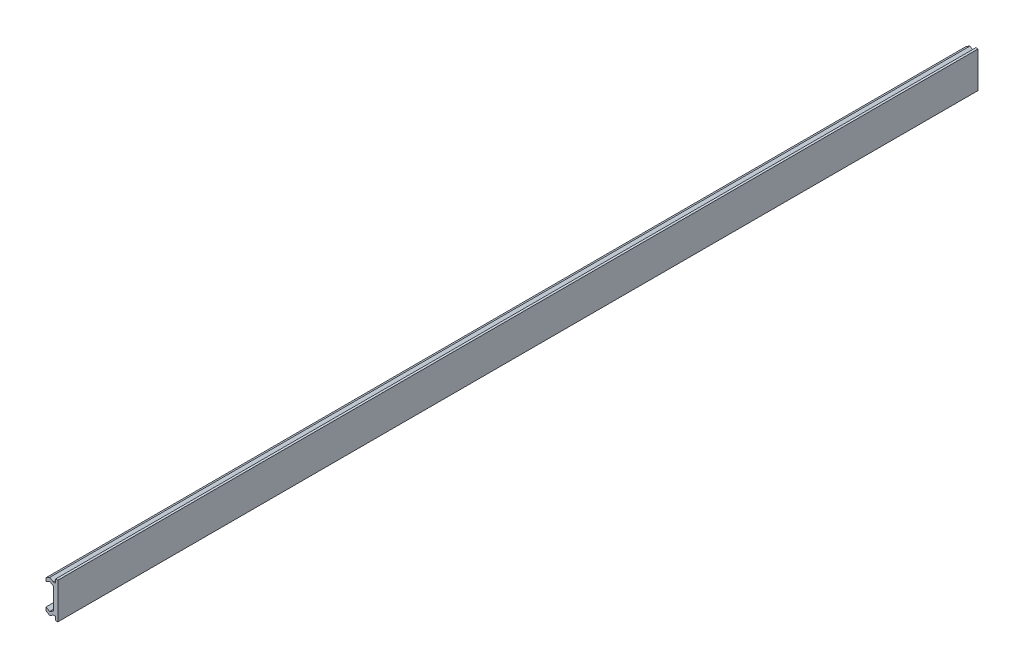
ISO-10303-21;
HEADER;
FILE_DESCRIPTION(('STEP AP214'),'2;1');
FILE_NAME('part.step','',(''),(''),'','','');
FILE_SCHEMA(('AUTOMOTIVE_DESIGN { 1 0 10303 214 1 1 1 1 }'));
ENDSEC;
DATA;
#1=APPLICATION_CONTEXT('core data for automotive mechanical design processes');
#2=APPLICATION_PROTOCOL_DEFINITION('international standard','automotive_design',2000,#1);
#3=PRODUCT_CONTEXT('',#1,'mechanical');
#4=PRODUCT('Part','Part','',(#3));
#5=PRODUCT_RELATED_PRODUCT_CATEGORY('part','',(#4));
#6=PRODUCT_DEFINITION_FORMATION('','',#4);
#7=PRODUCT_DEFINITION_CONTEXT('part definition',#1,'design');
#8=PRODUCT_DEFINITION('design','',#6,#7);
#9=PRODUCT_DEFINITION_SHAPE('','',#8);
#10=(LENGTH_UNIT() NAMED_UNIT(*) SI_UNIT(.MILLI.,.METRE.));
#11=(NAMED_UNIT(*) PLANE_ANGLE_UNIT() SI_UNIT($,.RADIAN.));
#12=(NAMED_UNIT(*) SI_UNIT($,.STERADIAN.) SOLID_ANGLE_UNIT());
#13=UNCERTAINTY_MEASURE_WITH_UNIT(LENGTH_MEASURE(1.E-05),#10,'distance_accuracy_value','');
#14=(GEOMETRIC_REPRESENTATION_CONTEXT(3) GLOBAL_UNCERTAINTY_ASSIGNED_CONTEXT((#13)) GLOBAL_UNIT_ASSIGNED_CONTEXT((#10,
#11,#12)) REPRESENTATION_CONTEXT('',''));
#15=CARTESIAN_POINT('',(0.,0.,0.));
#16=DIRECTION('',(0.,0.,1.));
#17=DIRECTION('',(1.,0.,0.));
#18=AXIS2_PLACEMENT_3D('',#15,#16,#17);
#19=CARTESIAN_POINT('',(0.,4.9,125.));
#20=DIRECTION('',(0.,-1.,0.));
#21=DIRECTION('',(0.,0.,-1.));
#22=AXIS2_PLACEMENT_3D('',#19,#20,#21);
#23=PLANE('',#22);
#24=DIRECTION('',(-1.,0.,0.));
#25=VECTOR('',#24,1.);
#26=CARTESIAN_POINT('',(0.,4.9,-125.));
#27=LINE('',#26,#25);
#28=CARTESIAN_POINT('',(0.,4.9,-125.));
#29=VERTEX_POINT('',#28);
#30=CARTESIAN_POINT('',(-0.6,4.9,-125.));
#31=VERTEX_POINT('',#30);
#32=EDGE_CURVE('E199',#29,#31,#27,.T.);
#33=ORIENTED_EDGE('',*,*,#32,.T.);
#34=DIRECTION('',(0.,0.,-1.));
#35=VECTOR('',#34,1.);
#36=CARTESIAN_POINT('',(-0.6,4.9,125.));
#37=LINE('',#36,#35);
#38=CARTESIAN_POINT('',(-0.6,4.9,125.));
#39=VERTEX_POINT('',#38);
#40=EDGE_CURVE('E11',#39,#31,#37,.T.);
#41=ORIENTED_EDGE('',*,*,#40,.F.);
#42=DIRECTION('',(-1.,0.,0.));
#43=VECTOR('',#42,1.);
#44=CARTESIAN_POINT('',(0.,4.9,125.));
#45=LINE('',#44,#43);
#46=CARTESIAN_POINT('',(0.,4.9,125.));
#47=VERTEX_POINT('',#46);
#48=EDGE_CURVE('E233',#47,#39,#45,.T.);
#49=ORIENTED_EDGE('',*,*,#48,.F.);
#50=DIRECTION('',(0.,0.,-1.));
#51=VECTOR('',#50,1.);
#52=CARTESIAN_POINT('',(0.,4.9,125.));
#53=LINE('',#52,#51);
#54=EDGE_CURVE('E195',#47,#29,#53,.T.);
#55=ORIENTED_EDGE('',*,*,#54,.T.);
#56=EDGE_LOOP('',(#33,#41,#49,#55));
#57=FACE_BOUND('',#56,.T.);
#58=ADVANCED_FACE('F41',(#57),#23,.F.);
#59=CARTESIAN_POINT('',(-0.6,4.9,125.));
#60=DIRECTION('',(1.,0.,0.));
#61=DIRECTION('',(0.,0.,-1.));
#62=AXIS2_PLACEMENT_3D('',#59,#60,#61);
#63=PLANE('',#62);
#64=DIRECTION('',(0.,-1.,0.));
#65=VECTOR('',#64,1.);
#66=CARTESIAN_POINT('',(-0.6,4.9,-125.));
#67=LINE('',#66,#65);
#68=CARTESIAN_POINT('',(-0.6,3.9,-125.));
#69=VERTEX_POINT('',#68);
#70=EDGE_CURVE('E202',#31,#69,#67,.T.);
#71=ORIENTED_EDGE('',*,*,#70,.T.);
#72=DIRECTION('',(0.,0.,-1.));
#73=VECTOR('',#72,1.);
#74=CARTESIAN_POINT('',(-0.6,3.9,125.));
#75=LINE('',#74,#73);
#76=CARTESIAN_POINT('',(-0.6,3.9,125.));
#77=VERTEX_POINT('',#76);
#78=EDGE_CURVE('E50',#77,#69,#75,.T.);
#79=ORIENTED_EDGE('',*,*,#78,.F.);
#80=DIRECTION('',(0.,-1.,0.));
#81=VECTOR('',#80,1.);
#82=CARTESIAN_POINT('',(-0.6,4.9,125.));
#83=LINE('',#82,#81);
#84=EDGE_CURVE('E131',#39,#77,#83,.T.);
#85=ORIENTED_EDGE('',*,*,#84,.F.);
#86=ORIENTED_EDGE('',*,*,#40,.T.);
#87=EDGE_LOOP('',(#71,#79,#85,#86));
#88=FACE_BOUND('',#87,.T.);
#89=ADVANCED_FACE('F356',(#88),#63,.F.);
#90=CARTESIAN_POINT('',(-0.6,3.9,125.));
#91=DIRECTION('',(0.,-1.,0.));
#92=DIRECTION('',(1.,0.,0.));
#93=AXIS2_PLACEMENT_3D('',#90,#91,#92);
#94=PLANE('',#93);
#95=DIRECTION('',(-1.,0.,0.));
#96=VECTOR('',#95,1.);
#97=CARTESIAN_POINT('',(-0.6,3.9,-125.));
#98=LINE('',#97,#96);
#99=CARTESIAN_POINT('',(-1.2,3.9,-125.));
#100=VERTEX_POINT('',#99);
#101=EDGE_CURVE('E204',#69,#100,#98,.T.);
#102=ORIENTED_EDGE('',*,*,#101,.T.);
#103=DIRECTION('',(0.,0.,-1.));
#104=VECTOR('',#103,1.);
#105=CARTESIAN_POINT('',(-1.2,3.9,125.));
#106=LINE('',#105,#104);
#107=CARTESIAN_POINT('',(-1.2,3.9,125.));
#108=VERTEX_POINT('',#107);
#109=EDGE_CURVE('E283',#108,#100,#106,.T.);
#110=ORIENTED_EDGE('',*,*,#109,.F.);
#111=DIRECTION('',(-1.,0.,0.));
#112=VECTOR('',#111,1.);
#113=CARTESIAN_POINT('',(-0.6,3.9,125.));
#114=LINE('',#113,#112);
#115=EDGE_CURVE('E293',#77,#108,#114,.T.);
#116=ORIENTED_EDGE('',*,*,#115,.F.);
#117=ORIENTED_EDGE('',*,*,#78,.T.);
#118=EDGE_LOOP('',(#102,#110,#116,#117));
#119=FACE_BOUND('',#118,.T.);
#120=ADVANCED_FACE('F291',(#119),#94,.F.);
#121=CARTESIAN_POINT('',(-1.2,3.9,125.));
#122=DIRECTION('',(-0.5,-0.866025403784439,0.));
#123=DIRECTION('',(0.866025403784438,-0.5,0.));
#124=AXIS2_PLACEMENT_3D('',#121,#122,#123);
#125=PLANE('',#124);
#126=DIRECTION('',(-0.866025403784438,0.5,0.));
#127=VECTOR('',#126,1.);
#128=CARTESIAN_POINT('',(-1.2,3.9,-125.));
#129=LINE('',#128,#127);
#130=CARTESIAN_POINT('',(-2.2,4.47735026918963,-125.));
#131=VERTEX_POINT('',#130);
#132=EDGE_CURVE('E206',#100,#131,#129,.T.);
#133=ORIENTED_EDGE('',*,*,#132,.T.);
#134=DIRECTION('',(0.,0.,-1.));
#135=VECTOR('',#134,1.);
#136=CARTESIAN_POINT('',(-2.2,4.47735026918963,125.));
#137=LINE('',#136,#135);
#138=CARTESIAN_POINT('',(-2.2,4.47735026918963,125.));
#139=VERTEX_POINT('',#138);
#140=EDGE_CURVE('E279',#139,#131,#137,.T.);
#141=ORIENTED_EDGE('',*,*,#140,.F.);
#142=DIRECTION('',(-0.866025403784438,0.5,0.));
#143=VECTOR('',#142,1.);
#144=CARTESIAN_POINT('',(-1.2,3.9,125.));
#145=LINE('',#144,#143);
#146=EDGE_CURVE('E311',#108,#139,#145,.T.);
#147=ORIENTED_EDGE('',*,*,#146,.F.);
#148=ORIENTED_EDGE('',*,*,#109,.T.);
#149=EDGE_LOOP('',(#133,#141,#147,#148));
#150=FACE_BOUND('',#149,.T.);
#151=ADVANCED_FACE('F302',(#150),#125,.F.);
#152=CARTESIAN_POINT('',(-2.2,4.47735026918963,125.));
#153=DIRECTION('',(0.500000000000002,-0.866025403784437,0.));
#154=DIRECTION('',(0.866025403784437,0.500000000000002,0.));
#155=AXIS2_PLACEMENT_3D('',#152,#153,#154);
#156=PLANE('',#155);
#157=DIRECTION('',(-0.866025403784437,-0.500000000000002,0.));
#158=VECTOR('',#157,1.);
#159=CARTESIAN_POINT('',(-2.2,4.47735026918963,-125.));
#160=LINE('',#159,#158);
#161=CARTESIAN_POINT('',(-3.2,3.9,-125.));
#162=VERTEX_POINT('',#161);
#163=EDGE_CURVE('E208',#131,#162,#160,.T.);
#164=ORIENTED_EDGE('',*,*,#163,.T.);
#165=DIRECTION('',(0.,0.,-1.));
#166=VECTOR('',#165,1.);
#167=CARTESIAN_POINT('',(-3.2,3.9,125.));
#168=LINE('',#167,#166);
#169=CARTESIAN_POINT('',(-3.2,3.9,125.));
#170=VERTEX_POINT('',#169);
#171=EDGE_CURVE('E276',#170,#162,#168,.T.);
#172=ORIENTED_EDGE('',*,*,#171,.F.);
#173=DIRECTION('',(-0.866025403784437,-0.500000000000002,0.));
#174=VECTOR('',#173,1.);
#175=CARTESIAN_POINT('',(-2.2,4.47735026918963,125.));
#176=LINE('',#175,#174);
#177=EDGE_CURVE('E308',#139,#170,#176,.T.);
#178=ORIENTED_EDGE('',*,*,#177,.F.);
#179=ORIENTED_EDGE('',*,*,#140,.T.);
#180=EDGE_LOOP('',(#164,#172,#178,#179));
#181=FACE_BOUND('',#180,.T.);
#182=ADVANCED_FACE('F306',(#181),#156,.F.);
#183=CARTESIAN_POINT('',(-3.2,3.9,125.));
#184=DIRECTION('',(1.,0.,0.));
#185=DIRECTION('',(0.,0.,-1.));
#186=AXIS2_PLACEMENT_3D('',#183,#184,#185);
#187=PLANE('',#186);
#188=DIRECTION('',(0.,-1.,0.));
#189=VECTOR('',#188,1.);
#190=CARTESIAN_POINT('',(-3.2,3.9,-125.));
#191=LINE('',#190,#189);
#192=CARTESIAN_POINT('',(-3.2,2.975,-125.));
#193=VERTEX_POINT('',#192);
#194=EDGE_CURVE('E210',#162,#193,#191,.T.);
#195=ORIENTED_EDGE('',*,*,#194,.T.);
#196=DIRECTION('',(0.,0.,-1.));
#197=VECTOR('',#196,1.);
#198=CARTESIAN_POINT('',(-3.2,2.975,125.));
#199=LINE('',#198,#197);
#200=CARTESIAN_POINT('',(-3.2,2.975,125.));
#201=VERTEX_POINT('',#200);
#202=EDGE_CURVE('E272',#201,#193,#199,.T.);
#203=ORIENTED_EDGE('',*,*,#202,.F.);
#204=DIRECTION('',(0.,-1.,0.));
#205=VECTOR('',#204,1.);
#206=CARTESIAN_POINT('',(-3.2,3.9,125.));
#207=LINE('',#206,#205);
#208=EDGE_CURVE('E310',#170,#201,#207,.T.);
#209=ORIENTED_EDGE('',*,*,#208,.F.);
#210=ORIENTED_EDGE('',*,*,#171,.T.);
#211=EDGE_LOOP('',(#195,#203,#209,#210));
#212=FACE_BOUND('',#211,.T.);
#213=ADVANCED_FACE('F369',(#212),#187,.F.);
#214=CARTESIAN_POINT('',(-3.2,2.975,125.));
#215=DIRECTION('',(-0.500000000000002,0.866025403784438,0.));
#216=DIRECTION('',(-0.866025403784438,-0.500000000000002,0.));
#217=AXIS2_PLACEMENT_3D('',#214,#215,#216);
#218=PLANE('',#217);
#219=DIRECTION('',(0.866025403784438,0.500000000000002,0.));
#220=VECTOR('',#219,1.);
#221=CARTESIAN_POINT('',(-3.2,2.975,-125.));
#222=LINE('',#221,#220);
#223=CARTESIAN_POINT('',(-2.2,3.55235026918963,-125.));
#224=VERTEX_POINT('',#223);
#225=EDGE_CURVE('E212',#193,#224,#222,.T.);
#226=ORIENTED_EDGE('',*,*,#225,.T.);
#227=DIRECTION('',(0.,0.,-1.));
#228=VECTOR('',#227,1.);
#229=CARTESIAN_POINT('',(-2.2,3.55235026918963,125.));
#230=LINE('',#229,#228);
#231=CARTESIAN_POINT('',(-2.2,3.55235026918963,125.));
#232=VERTEX_POINT('',#231);
#233=EDGE_CURVE('E268',#232,#224,#230,.T.);
#234=ORIENTED_EDGE('',*,*,#233,.F.);
#235=DIRECTION('',(0.866025403784438,0.500000000000002,0.));
#236=VECTOR('',#235,1.);
#237=CARTESIAN_POINT('',(-3.2,2.975,125.));
#238=LINE('',#237,#236);
#239=EDGE_CURVE('E313',#201,#232,#238,.T.);
#240=ORIENTED_EDGE('',*,*,#239,.F.);
#241=ORIENTED_EDGE('',*,*,#202,.T.);
#242=EDGE_LOOP('',(#226,#234,#240,#241));
#243=FACE_BOUND('',#242,.T.);
#244=ADVANCED_FACE('F372',(#243),#218,.F.);
#245=CARTESIAN_POINT('',(-2.2,3.55235026918963,125.));
#246=DIRECTION('',(0.500000000000001,0.866025403784438,0.));
#247=DIRECTION('',(-0.866025403784438,0.500000000000001,0.));
#248=AXIS2_PLACEMENT_3D('',#245,#246,#247);
#249=PLANE('',#248);
#250=DIRECTION('',(0.866025403784438,-0.500000000000001,0.));
#251=VECTOR('',#250,1.);
#252=CARTESIAN_POINT('',(-2.2,3.55235026918963,-125.));
#253=LINE('',#252,#251);
#254=CARTESIAN_POINT('',(-1.2,2.975,-125.));
#255=VERTEX_POINT('',#254);
#256=EDGE_CURVE('E214',#224,#255,#253,.T.);
#257=ORIENTED_EDGE('',*,*,#256,.T.);
#258=DIRECTION('',(0.,0.,-1.));
#259=VECTOR('',#258,1.);
#260=CARTESIAN_POINT('',(-1.2,2.975,125.));
#261=LINE('',#260,#259);
#262=CARTESIAN_POINT('',(-1.2,2.975,125.));
#263=VERTEX_POINT('',#262);
#264=EDGE_CURVE('E264',#263,#255,#261,.T.);
#265=ORIENTED_EDGE('',*,*,#264,.F.);
#266=DIRECTION('',(0.866025403784438,-0.500000000000001,0.));
#267=VECTOR('',#266,1.);
#268=CARTESIAN_POINT('',(-2.2,3.55235026918963,125.));
#269=LINE('',#268,#267);
#270=EDGE_CURVE('E319',#232,#263,#269,.T.);
#271=ORIENTED_EDGE('',*,*,#270,.F.);
#272=ORIENTED_EDGE('',*,*,#233,.T.);
#273=EDGE_LOOP('',(#257,#265,#271,#272));
#274=FACE_BOUND('',#273,.T.);
#275=ADVANCED_FACE('F376',(#274),#249,.F.);
#276=CARTESIAN_POINT('',(-1.2,2.975,125.));
#277=DIRECTION('',(1.,0.,0.));
#278=DIRECTION('',(0.,0.,-1.));
#279=AXIS2_PLACEMENT_3D('',#276,#277,#278);
#280=PLANE('',#279);
#281=DIRECTION('',(0.,-1.,0.));
#282=VECTOR('',#281,1.);
#283=CARTESIAN_POINT('',(-1.2,2.975,-125.));
#284=LINE('',#283,#282);
#285=CARTESIAN_POINT('',(-1.2,-2.975,-125.));
#286=VERTEX_POINT('',#285);
#287=EDGE_CURVE('E216',#255,#286,#284,.T.);
#288=ORIENTED_EDGE('',*,*,#287,.T.);
#289=DIRECTION('',(0.,0.,-1.));
#290=VECTOR('',#289,1.);
#291=CARTESIAN_POINT('',(-1.2,-2.975,125.));
#292=LINE('',#291,#290);
#293=CARTESIAN_POINT('',(-1.2,-2.975,125.));
#294=VERTEX_POINT('',#293);
#295=EDGE_CURVE('E260',#294,#286,#292,.T.);
#296=ORIENTED_EDGE('',*,*,#295,.F.);
#297=DIRECTION('',(0.,-1.,0.));
#298=VECTOR('',#297,1.);
#299=CARTESIAN_POINT('',(-1.2,2.975,125.));
#300=LINE('',#299,#298);
#301=EDGE_CURVE('E321',#263,#294,#300,.T.);
#302=ORIENTED_EDGE('',*,*,#301,.F.);
#303=ORIENTED_EDGE('',*,*,#264,.T.);
#304=EDGE_LOOP('',(#288,#296,#302,#303));
#305=FACE_BOUND('',#304,.T.);
#306=ADVANCED_FACE('F380',(#305),#280,.F.);
#307=CARTESIAN_POINT('',(-2.2,-3.55235026918963,125.));
#308=DIRECTION('',(0.500000000000001,-0.866025403784438,0.));
#309=DIRECTION('',(0.866025403784438,0.500000000000001,0.));
#310=AXIS2_PLACEMENT_3D('',#307,#308,#309);
#311=PLANE('',#310);
#312=DIRECTION('',(-0.866025403784438,-0.500000000000001,0.));
#313=VECTOR('',#312,1.);
#314=CARTESIAN_POINT('',(-2.2,-3.55235026918963,-125.));
#315=LINE('',#314,#313);
#316=CARTESIAN_POINT('',(-2.2,-3.55235026918963,-125.));
#317=VERTEX_POINT('',#316);
#318=EDGE_CURVE('E218',#286,#317,#315,.T.);
#319=ORIENTED_EDGE('',*,*,#318,.T.);
#320=DIRECTION('',(0.,0.,-1.));
#321=VECTOR('',#320,1.);
#322=CARTESIAN_POINT('',(-2.2,-3.55235026918963,125.));
#323=LINE('',#322,#321);
#324=CARTESIAN_POINT('',(-2.2,-3.55235026918963,125.));
#325=VERTEX_POINT('',#324);
#326=EDGE_CURVE('E256',#325,#317,#323,.T.);
#327=ORIENTED_EDGE('',*,*,#326,.F.);
#328=DIRECTION('',(-0.866025403784438,-0.500000000000001,0.));
#329=VECTOR('',#328,1.);
#330=CARTESIAN_POINT('',(-2.2,-3.55235026918963,125.));
#331=LINE('',#330,#329);
#332=EDGE_CURVE('E323',#294,#325,#331,.T.);
#333=ORIENTED_EDGE('',*,*,#332,.F.);
#334=ORIENTED_EDGE('',*,*,#295,.T.);
#335=EDGE_LOOP('',(#319,#327,#333,#334));
#336=FACE_BOUND('',#335,.T.);
#337=ADVANCED_FACE('F384',(#336),#311,.F.);
#338=CARTESIAN_POINT('',(-3.2,-2.975,125.));
#339=DIRECTION('',(-0.500000000000002,-0.866025403784438,0.));
#340=DIRECTION('',(0.866025403784438,-0.500000000000002,0.));
#341=AXIS2_PLACEMENT_3D('',#338,#339,#340);
#342=PLANE('',#341);
#343=DIRECTION('',(-0.866025403784438,0.500000000000002,0.));
#344=VECTOR('',#343,1.);
#345=CARTESIAN_POINT('',(-3.2,-2.975,-125.));
#346=LINE('',#345,#344);
#347=CARTESIAN_POINT('',(-3.2,-2.975,-125.));
#348=VERTEX_POINT('',#347);
#349=EDGE_CURVE('E220',#317,#348,#346,.T.);
#350=ORIENTED_EDGE('',*,*,#349,.T.);
#351=DIRECTION('',(0.,0.,-1.));
#352=VECTOR('',#351,1.);
#353=CARTESIAN_POINT('',(-3.2,-2.975,125.));
#354=LINE('',#353,#352);
#355=CARTESIAN_POINT('',(-3.2,-2.975,125.));
#356=VERTEX_POINT('',#355);
#357=EDGE_CURVE('E252',#356,#348,#354,.T.);
#358=ORIENTED_EDGE('',*,*,#357,.F.);
#359=DIRECTION('',(-0.866025403784438,0.500000000000002,0.));
#360=VECTOR('',#359,1.);
#361=CARTESIAN_POINT('',(-3.2,-2.975,125.));
#362=LINE('',#361,#360);
#363=EDGE_CURVE('E325',#325,#356,#362,.T.);
#364=ORIENTED_EDGE('',*,*,#363,.F.);
#365=ORIENTED_EDGE('',*,*,#326,.T.);
#366=EDGE_LOOP('',(#350,#358,#364,#365));
#367=FACE_BOUND('',#366,.T.);
#368=ADVANCED_FACE('F388',(#367),#342,.F.);
#369=CARTESIAN_POINT('',(-3.2,-3.9,125.));
#370=DIRECTION('',(1.,0.,0.));
#371=DIRECTION('',(0.,0.,-1.));
#372=AXIS2_PLACEMENT_3D('',#369,#370,#371);
#373=PLANE('',#372);
#374=DIRECTION('',(0.,-1.,0.));
#375=VECTOR('',#374,1.);
#376=CARTESIAN_POINT('',(-3.2,-3.9,-125.));
#377=LINE('',#376,#375);
#378=CARTESIAN_POINT('',(-3.2,-3.9,-125.));
#379=VERTEX_POINT('',#378);
#380=EDGE_CURVE('E222',#348,#379,#377,.T.);
#381=ORIENTED_EDGE('',*,*,#380,.T.);
#382=DIRECTION('',(0.,0.,-1.));
#383=VECTOR('',#382,1.);
#384=CARTESIAN_POINT('',(-3.2,-3.9,125.));
#385=LINE('',#384,#383);
#386=CARTESIAN_POINT('',(-3.2,-3.9,125.));
#387=VERTEX_POINT('',#386);
#388=EDGE_CURVE('E248',#387,#379,#385,.T.);
#389=ORIENTED_EDGE('',*,*,#388,.F.);
#390=DIRECTION('',(0.,-1.,0.));
#391=VECTOR('',#390,1.);
#392=CARTESIAN_POINT('',(-3.2,-3.9,125.));
#393=LINE('',#392,#391);
#394=EDGE_CURVE('E327',#356,#387,#393,.T.);
#395=ORIENTED_EDGE('',*,*,#394,.F.);
#396=ORIENTED_EDGE('',*,*,#357,.T.);
#397=EDGE_LOOP('',(#381,#389,#395,#396));
#398=FACE_BOUND('',#397,.T.);
#399=ADVANCED_FACE('F392',(#398),#373,.F.);
#400=CARTESIAN_POINT('',(-2.2,-4.47735026918963,125.));
#401=DIRECTION('',(0.500000000000002,0.866025403784437,0.));
#402=DIRECTION('',(-0.866025403784437,0.500000000000002,0.));
#403=AXIS2_PLACEMENT_3D('',#400,#401,#402);
#404=PLANE('',#403);
#405=DIRECTION('',(0.866025403784437,-0.500000000000002,0.));
#406=VECTOR('',#405,1.);
#407=CARTESIAN_POINT('',(-2.2,-4.47735026918963,-125.));
#408=LINE('',#407,#406);
#409=CARTESIAN_POINT('',(-2.2,-4.47735026918963,-125.));
#410=VERTEX_POINT('',#409);
#411=EDGE_CURVE('E224',#379,#410,#408,.T.);
#412=ORIENTED_EDGE('',*,*,#411,.T.);
#413=DIRECTION('',(0.,0.,-1.));
#414=VECTOR('',#413,1.);
#415=CARTESIAN_POINT('',(-2.2,-4.47735026918963,125.));
#416=LINE('',#415,#414);
#417=CARTESIAN_POINT('',(-2.2,-4.47735026918963,125.));
#418=VERTEX_POINT('',#417);
#419=EDGE_CURVE('E244',#418,#410,#416,.T.);
#420=ORIENTED_EDGE('',*,*,#419,.F.);
#421=DIRECTION('',(0.866025403784437,-0.500000000000002,0.));
#422=VECTOR('',#421,1.);
#423=CARTESIAN_POINT('',(-2.2,-4.47735026918963,125.));
#424=LINE('',#423,#422);
#425=EDGE_CURVE('E329',#387,#418,#424,.T.);
#426=ORIENTED_EDGE('',*,*,#425,.F.);
#427=ORIENTED_EDGE('',*,*,#388,.T.);
#428=EDGE_LOOP('',(#412,#420,#426,#427));
#429=FACE_BOUND('',#428,.T.);
#430=ADVANCED_FACE('F396',(#429),#404,.F.);
#431=CARTESIAN_POINT('',(-1.2,-3.9,125.));
#432=DIRECTION('',(-0.5,0.866025403784439,0.));
#433=DIRECTION('',(-0.866025403784438,-0.5,0.));
#434=AXIS2_PLACEMENT_3D('',#431,#432,#433);
#435=PLANE('',#434);
#436=DIRECTION('',(0.866025403784438,0.5,0.));
#437=VECTOR('',#436,1.);
#438=CARTESIAN_POINT('',(-1.2,-3.9,-125.));
#439=LINE('',#438,#437);
#440=CARTESIAN_POINT('',(-1.2,-3.9,-125.));
#441=VERTEX_POINT('',#440);
#442=EDGE_CURVE('E226',#410,#441,#439,.T.);
#443=ORIENTED_EDGE('',*,*,#442,.T.);
#444=DIRECTION('',(0.,0.,-1.));
#445=VECTOR('',#444,1.);
#446=CARTESIAN_POINT('',(-1.2,-3.9,125.));
#447=LINE('',#446,#445);
#448=CARTESIAN_POINT('',(-1.2,-3.9,125.));
#449=VERTEX_POINT('',#448);
#450=EDGE_CURVE('E240',#449,#441,#447,.T.);
#451=ORIENTED_EDGE('',*,*,#450,.F.);
#452=DIRECTION('',(0.866025403784438,0.5,0.));
#453=VECTOR('',#452,1.);
#454=CARTESIAN_POINT('',(-1.2,-3.9,125.));
#455=LINE('',#454,#453);
#456=EDGE_CURVE('E331',#418,#449,#455,.T.);
#457=ORIENTED_EDGE('',*,*,#456,.F.);
#458=ORIENTED_EDGE('',*,*,#419,.T.);
#459=EDGE_LOOP('',(#443,#451,#457,#458));
#460=FACE_BOUND('',#459,.T.);
#461=ADVANCED_FACE('F337',(#460),#435,.F.);
#462=CARTESIAN_POINT('',(-0.6,-3.9,125.));
#463=DIRECTION('',(0.,1.,0.));
#464=DIRECTION('',(-1.,0.,0.));
#465=AXIS2_PLACEMENT_3D('',#462,#463,#464);
#466=PLANE('',#465);
#467=DIRECTION('',(1.,0.,0.));
#468=VECTOR('',#467,1.);
#469=CARTESIAN_POINT('',(-0.6,-3.9,-125.));
#470=LINE('',#469,#468);
#471=CARTESIAN_POINT('',(-0.6,-3.9,-125.));
#472=VERTEX_POINT('',#471);
#473=EDGE_CURVE('E228',#441,#472,#470,.T.);
#474=ORIENTED_EDGE('',*,*,#473,.T.);
#475=DIRECTION('',(0.,0.,-1.));
#476=VECTOR('',#475,1.);
#477=CARTESIAN_POINT('',(-0.6,-3.9,125.));
#478=LINE('',#477,#476);
#479=CARTESIAN_POINT('',(-0.6,-3.9,125.));
#480=VERTEX_POINT('',#479);
#481=EDGE_CURVE('E190',#480,#472,#478,.T.);
#482=ORIENTED_EDGE('',*,*,#481,.F.);
#483=DIRECTION('',(1.,0.,0.));
#484=VECTOR('',#483,1.);
#485=CARTESIAN_POINT('',(-0.6,-3.9,125.));
#486=LINE('',#485,#484);
#487=EDGE_CURVE('E180',#449,#480,#486,.T.);
#488=ORIENTED_EDGE('',*,*,#487,.F.);
#489=ORIENTED_EDGE('',*,*,#450,.T.);
#490=EDGE_LOOP('',(#474,#482,#488,#489));
#491=FACE_BOUND('',#490,.T.);
#492=ADVANCED_FACE('F341',(#491),#466,.F.);
#493=CARTESIAN_POINT('',(-0.6,-4.9,125.));
#494=DIRECTION('',(1.,0.,0.));
#495=DIRECTION('',(0.,0.,-1.));
#496=AXIS2_PLACEMENT_3D('',#493,#494,#495);
#497=PLANE('',#496);
#498=DIRECTION('',(0.,-1.,0.));
#499=VECTOR('',#498,1.);
#500=CARTESIAN_POINT('',(-0.6,-4.9,-125.));
#501=LINE('',#500,#499);
#502=CARTESIAN_POINT('',(-0.6,-4.9,-125.));
#503=VERTEX_POINT('',#502);
#504=EDGE_CURVE('E188',#472,#503,#501,.T.);
#505=ORIENTED_EDGE('',*,*,#504,.T.);
#506=DIRECTION('',(0.,0.,-1.));
#507=VECTOR('',#506,1.);
#508=CARTESIAN_POINT('',(-0.6,-4.9,125.));
#509=LINE('',#508,#507);
#510=CARTESIAN_POINT('',(-0.6,-4.9,125.));
#511=VERTEX_POINT('',#510);
#512=EDGE_CURVE('E185',#511,#503,#509,.T.);
#513=ORIENTED_EDGE('',*,*,#512,.F.);
#514=DIRECTION('',(0.,-1.,0.));
#515=VECTOR('',#514,1.);
#516=CARTESIAN_POINT('',(-0.6,-4.9,125.));
#517=LINE('',#516,#515);
#518=EDGE_CURVE('E174',#480,#511,#517,.T.);
#519=ORIENTED_EDGE('',*,*,#518,.F.);
#520=ORIENTED_EDGE('',*,*,#481,.T.);
#521=EDGE_LOOP('',(#505,#513,#519,#520));
#522=FACE_BOUND('',#521,.T.);
#523=ADVANCED_FACE('F186',(#522),#497,.F.);
#524=CARTESIAN_POINT('',(0.,-4.9,125.));
#525=DIRECTION('',(0.,1.,0.));
#526=DIRECTION('',(0.,0.,1.));
#527=AXIS2_PLACEMENT_3D('',#524,#525,#526);
#528=PLANE('',#527);
#529=DIRECTION('',(1.,0.,0.));
#530=VECTOR('',#529,1.);
#531=CARTESIAN_POINT('',(0.,-4.9,-125.));
#532=LINE('',#531,#530);
#533=CARTESIAN_POINT('',(0.,-4.9,-125.));
#534=VERTEX_POINT('',#533);
#535=EDGE_CURVE('E117',#503,#534,#532,.T.);
#536=ORIENTED_EDGE('',*,*,#535,.T.);
#537=DIRECTION('',(0.,0.,-1.));
#538=VECTOR('',#537,1.);
#539=CARTESIAN_POINT('',(0.,-4.9,125.));
#540=LINE('',#539,#538);
#541=CARTESIAN_POINT('',(0.,-4.9,125.));
#542=VERTEX_POINT('',#541);
#543=EDGE_CURVE('E191',#542,#534,#540,.T.);
#544=ORIENTED_EDGE('',*,*,#543,.F.);
#545=DIRECTION('',(1.,0.,0.));
#546=VECTOR('',#545,1.);
#547=CARTESIAN_POINT('',(0.,-4.9,125.));
#548=LINE('',#547,#546);
#549=EDGE_CURVE('E178',#511,#542,#548,.T.);
#550=ORIENTED_EDGE('',*,*,#549,.F.);
#551=ORIENTED_EDGE('',*,*,#512,.T.);
#552=EDGE_LOOP('',(#536,#544,#550,#551));
#553=FACE_BOUND('',#552,.T.);
#554=ADVANCED_FACE('F193',(#553),#528,.F.);
#555=CARTESIAN_POINT('',(0.,-4.9,125.));
#556=DIRECTION('',(-1.,0.,0.));
#557=DIRECTION('',(0.,0.,1.));
#558=AXIS2_PLACEMENT_3D('',#555,#556,#557);
#559=PLANE('',#558);
#560=DIRECTION('',(0.,1.,0.));
#561=VECTOR('',#560,1.);
#562=CARTESIAN_POINT('',(0.,-4.9,-125.));
#563=LINE('',#562,#561);
#564=EDGE_CURVE('E123',#534,#29,#563,.T.);
#565=ORIENTED_EDGE('',*,*,#564,.T.);
#566=ORIENTED_EDGE('',*,*,#54,.F.);
#567=DIRECTION('',(0.,1.,0.));
#568=VECTOR('',#567,1.);
#569=CARTESIAN_POINT('',(0.,-4.9,125.));
#570=LINE('',#569,#568);
#571=EDGE_CURVE('E58',#542,#47,#570,.T.);
#572=ORIENTED_EDGE('',*,*,#571,.F.);
#573=ORIENTED_EDGE('',*,*,#543,.T.);
#574=EDGE_LOOP('',(#565,#566,#572,#573));
#575=FACE_BOUND('',#574,.T.);
#576=ADVANCED_FACE('F345',(#575),#559,.F.);
#577=CARTESIAN_POINT('',(0.,0.,125.));
#578=DIRECTION('',(0.,0.,1.));
#579=DIRECTION('',(1.,0.,0.));
#580=AXIS2_PLACEMENT_3D('',#577,#578,#579);
#581=PLANE('',#580);
#582=ORIENTED_EDGE('',*,*,#48,.T.);
#583=ORIENTED_EDGE('',*,*,#84,.T.);
#584=ORIENTED_EDGE('',*,*,#115,.T.);
#585=ORIENTED_EDGE('',*,*,#146,.T.);
#586=ORIENTED_EDGE('',*,*,#177,.T.);
#587=ORIENTED_EDGE('',*,*,#208,.T.);
#588=ORIENTED_EDGE('',*,*,#239,.T.);
#589=ORIENTED_EDGE('',*,*,#270,.T.);
#590=ORIENTED_EDGE('',*,*,#301,.T.);
#591=ORIENTED_EDGE('',*,*,#332,.T.);
#592=ORIENTED_EDGE('',*,*,#363,.T.);
#593=ORIENTED_EDGE('',*,*,#394,.T.);
#594=ORIENTED_EDGE('',*,*,#425,.T.);
#595=ORIENTED_EDGE('',*,*,#456,.T.);
#596=ORIENTED_EDGE('',*,*,#487,.T.);
#597=ORIENTED_EDGE('',*,*,#518,.T.);
#598=ORIENTED_EDGE('',*,*,#549,.T.);
#599=ORIENTED_EDGE('',*,*,#571,.T.);
#600=EDGE_LOOP('',(#582,#583,#584,#585,#586,#587,#588,#589,#590,#591,#592,#593,#594,#595,#596,
#597,#598,#599));
#601=FACE_BOUND('',#600,.T.);
#602=ADVANCED_FACE('F176',(#601),#581,.T.);
#603=CARTESIAN_POINT('',(0.,0.,-125.));
#604=DIRECTION('',(0.,0.,1.));
#605=DIRECTION('',(1.,0.,0.));
#606=AXIS2_PLACEMENT_3D('',#603,#604,#605);
#607=PLANE('',#606);
#608=ORIENTED_EDGE('',*,*,#32,.F.);
#609=ORIENTED_EDGE('',*,*,#564,.F.);
#610=ORIENTED_EDGE('',*,*,#535,.F.);
#611=ORIENTED_EDGE('',*,*,#504,.F.);
#612=ORIENTED_EDGE('',*,*,#473,.F.);
#613=ORIENTED_EDGE('',*,*,#442,.F.);
#614=ORIENTED_EDGE('',*,*,#411,.F.);
#615=ORIENTED_EDGE('',*,*,#380,.F.);
#616=ORIENTED_EDGE('',*,*,#349,.F.);
#617=ORIENTED_EDGE('',*,*,#318,.F.);
#618=ORIENTED_EDGE('',*,*,#287,.F.);
#619=ORIENTED_EDGE('',*,*,#256,.F.);
#620=ORIENTED_EDGE('',*,*,#225,.F.);
#621=ORIENTED_EDGE('',*,*,#194,.F.);
#622=ORIENTED_EDGE('',*,*,#163,.F.);
#623=ORIENTED_EDGE('',*,*,#132,.F.);
#624=ORIENTED_EDGE('',*,*,#101,.F.);
#625=ORIENTED_EDGE('',*,*,#70,.F.);
#626=EDGE_LOOP('',(#608,#609,#610,#611,#612,#613,#614,#615,#616,#617,#618,#619,#620,#621,#622,
#623,#624,#625));
#627=FACE_BOUND('',#626,.T.);
#628=ADVANCED_FACE('F297',(#627),#607,.F.);
#629=CLOSED_SHELL('',(#58,#89,#120,#151,#182,#213,#244,#275,#306,#337,#368,#399,#430,#461,#492,
#523,#554,#576,#602,#628));
#630=MANIFOLD_SOLID_BREP('B2',#629);
#631=ADVANCED_BREP_SHAPE_REPRESENTATION('',(#18,#630),#14);
#632=SHAPE_DEFINITION_REPRESENTATION(#9,#631);
ENDSEC;
END-ISO-10303-21;
